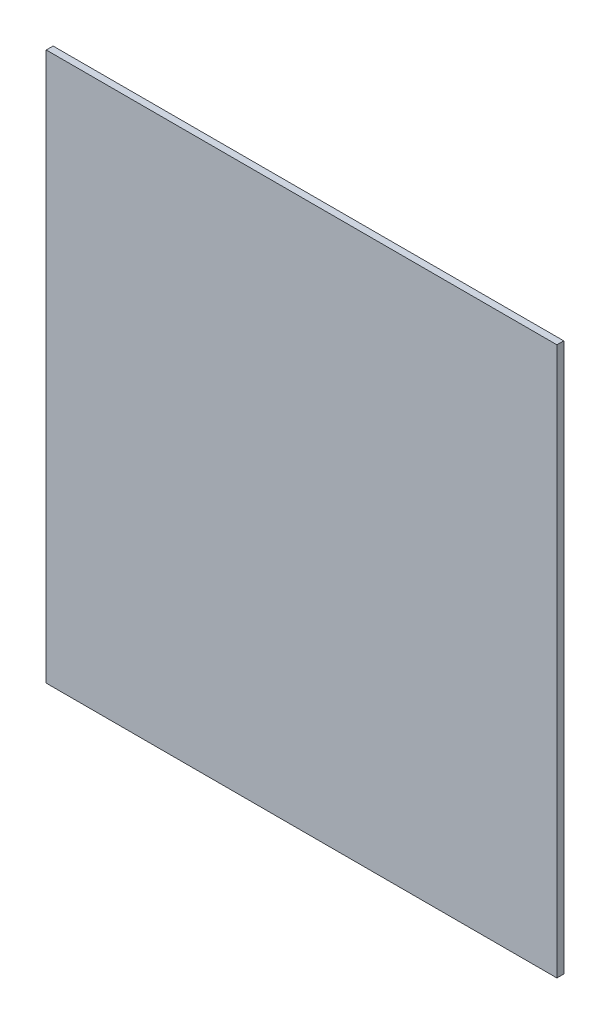
ISO-10303-21;
HEADER;
FILE_DESCRIPTION(('STEP AP214'),'2;1');
FILE_NAME('part.step','',(''),(''),'','','');
FILE_SCHEMA(('AUTOMOTIVE_DESIGN { 1 0 10303 214 1 1 1 1 }'));
ENDSEC;
DATA;
#1=APPLICATION_CONTEXT('core data for automotive mechanical design processes');
#2=APPLICATION_PROTOCOL_DEFINITION('international standard','automotive_design',2000,#1);
#3=PRODUCT_CONTEXT('',#1,'mechanical');
#4=PRODUCT('Part','Part','',(#3));
#5=PRODUCT_RELATED_PRODUCT_CATEGORY('part','',(#4));
#6=PRODUCT_DEFINITION_FORMATION('','',#4);
#7=PRODUCT_DEFINITION_CONTEXT('part definition',#1,'design');
#8=PRODUCT_DEFINITION('design','',#6,#7);
#9=PRODUCT_DEFINITION_SHAPE('','',#8);
#10=(LENGTH_UNIT() NAMED_UNIT(*) SI_UNIT(.MILLI.,.METRE.));
#11=(NAMED_UNIT(*) PLANE_ANGLE_UNIT() SI_UNIT($,.RADIAN.));
#12=(NAMED_UNIT(*) SI_UNIT($,.STERADIAN.) SOLID_ANGLE_UNIT());
#13=UNCERTAINTY_MEASURE_WITH_UNIT(LENGTH_MEASURE(1.E-05),#10,'distance_accuracy_value','');
#14=(GEOMETRIC_REPRESENTATION_CONTEXT(3) GLOBAL_UNCERTAINTY_ASSIGNED_CONTEXT((#13)) GLOBAL_UNIT_ASSIGNED_CONTEXT((#10,
#11,#12)) REPRESENTATION_CONTEXT('',''));
#15=CARTESIAN_POINT('',(0.,0.,0.));
#16=DIRECTION('',(0.,0.,1.));
#17=DIRECTION('',(1.,0.,0.));
#18=AXIS2_PLACEMENT_3D('',#15,#16,#17);
#19=CARTESIAN_POINT('',(74.5,-80.,2.));
#20=DIRECTION('',(-1.,0.,0.));
#21=DIRECTION('',(0.,0.,1.));
#22=AXIS2_PLACEMENT_3D('',#19,#20,#21);
#23=PLANE('',#22);
#24=DIRECTION('',(0.,1.,0.));
#25=VECTOR('',#24,1.);
#26=CARTESIAN_POINT('',(74.5,-80.,0.));
#27=LINE('',#26,#25);
#28=CARTESIAN_POINT('',(74.5,-80.,0.));
#29=VERTEX_POINT('',#28);
#30=CARTESIAN_POINT('',(74.5,80.,0.));
#31=VERTEX_POINT('',#30);
#32=EDGE_CURVE('E132',#29,#31,#27,.T.);
#33=ORIENTED_EDGE('',*,*,#32,.T.);
#34=DIRECTION('',(0.,0.,-1.));
#35=VECTOR('',#34,1.);
#36=CARTESIAN_POINT('',(74.5,80.,2.));
#37=LINE('',#36,#35);
#38=CARTESIAN_POINT('',(74.5,80.,2.));
#39=VERTEX_POINT('',#38);
#40=EDGE_CURVE('E43',#39,#31,#37,.T.);
#41=ORIENTED_EDGE('',*,*,#40,.F.);
#42=DIRECTION('',(0.,1.,0.));
#43=VECTOR('',#42,1.);
#44=CARTESIAN_POINT('',(74.5,-80.,2.));
#45=LINE('',#44,#43);
#46=CARTESIAN_POINT('',(74.5,-80.,2.));
#47=VERTEX_POINT('',#46);
#48=EDGE_CURVE('E120',#47,#39,#45,.T.);
#49=ORIENTED_EDGE('',*,*,#48,.F.);
#50=DIRECTION('',(0.,0.,-1.));
#51=VECTOR('',#50,1.);
#52=CARTESIAN_POINT('',(74.5,-80.,2.));
#53=LINE('',#52,#51);
#54=EDGE_CURVE('E128',#47,#29,#53,.T.);
#55=ORIENTED_EDGE('',*,*,#54,.T.);
#56=EDGE_LOOP('',(#33,#41,#49,#55));
#57=FACE_BOUND('',#56,.T.);
#58=ADVANCED_FACE('F69',(#57),#23,.F.);
#59=CARTESIAN_POINT('',(-74.5,80.,2.));
#60=DIRECTION('',(0.,-1.,0.));
#61=DIRECTION('',(0.,0.,-1.));
#62=AXIS2_PLACEMENT_3D('',#59,#60,#61);
#63=PLANE('',#62);
#64=DIRECTION('',(-1.,0.,0.));
#65=VECTOR('',#64,1.);
#66=CARTESIAN_POINT('',(-74.5,80.,0.));
#67=LINE('',#66,#65);
#68=CARTESIAN_POINT('',(-74.5,80.,0.));
#69=VERTEX_POINT('',#68);
#70=EDGE_CURVE('E124',#31,#69,#67,.T.);
#71=ORIENTED_EDGE('',*,*,#70,.T.);
#72=DIRECTION('',(0.,0.,-1.));
#73=VECTOR('',#72,1.);
#74=CARTESIAN_POINT('',(-74.5,80.,2.));
#75=LINE('',#74,#73);
#76=CARTESIAN_POINT('',(-74.5,80.,2.));
#77=VERTEX_POINT('',#76);
#78=EDGE_CURVE('E77',#77,#69,#75,.T.);
#79=ORIENTED_EDGE('',*,*,#78,.F.);
#80=DIRECTION('',(-1.,0.,0.));
#81=VECTOR('',#80,1.);
#82=CARTESIAN_POINT('',(-74.5,80.,2.));
#83=LINE('',#82,#81);
#84=EDGE_CURVE('E115',#39,#77,#83,.T.);
#85=ORIENTED_EDGE('',*,*,#84,.F.);
#86=ORIENTED_EDGE('',*,*,#40,.T.);
#87=EDGE_LOOP('',(#71,#79,#85,#86));
#88=FACE_BOUND('',#87,.T.);
#89=ADVANCED_FACE('F123',(#88),#63,.F.);
#90=CARTESIAN_POINT('',(-74.5,-80.,2.));
#91=DIRECTION('',(1.,0.,0.));
#92=DIRECTION('',(0.,0.,-1.));
#93=AXIS2_PLACEMENT_3D('',#90,#91,#92);
#94=PLANE('',#93);
#95=DIRECTION('',(0.,-1.,0.));
#96=VECTOR('',#95,1.);
#97=CARTESIAN_POINT('',(-74.5,-80.,0.));
#98=LINE('',#97,#96);
#99=CARTESIAN_POINT('',(-74.5,-80.,0.));
#100=VERTEX_POINT('',#99);
#101=EDGE_CURVE('E102',#69,#100,#98,.T.);
#102=ORIENTED_EDGE('',*,*,#101,.T.);
#103=DIRECTION('',(0.,0.,-1.));
#104=VECTOR('',#103,1.);
#105=CARTESIAN_POINT('',(-74.5,-80.,2.));
#106=LINE('',#105,#104);
#107=CARTESIAN_POINT('',(-74.5,-80.,2.));
#108=VERTEX_POINT('',#107);
#109=EDGE_CURVE('E125',#108,#100,#106,.T.);
#110=ORIENTED_EDGE('',*,*,#109,.F.);
#111=DIRECTION('',(0.,-1.,0.));
#112=VECTOR('',#111,1.);
#113=CARTESIAN_POINT('',(-74.5,-80.,2.));
#114=LINE('',#113,#112);
#115=EDGE_CURVE('E118',#77,#108,#114,.T.);
#116=ORIENTED_EDGE('',*,*,#115,.F.);
#117=ORIENTED_EDGE('',*,*,#78,.T.);
#118=EDGE_LOOP('',(#102,#110,#116,#117));
#119=FACE_BOUND('',#118,.T.);
#120=ADVANCED_FACE('F126',(#119),#94,.F.);
#121=CARTESIAN_POINT('',(-74.5,-80.,2.));
#122=DIRECTION('',(0.,1.,0.));
#123=DIRECTION('',(0.,0.,1.));
#124=AXIS2_PLACEMENT_3D('',#121,#122,#123);
#125=PLANE('',#124);
#126=DIRECTION('',(1.,0.,0.));
#127=VECTOR('',#126,1.);
#128=CARTESIAN_POINT('',(-74.5,-80.,0.));
#129=LINE('',#128,#127);
#130=EDGE_CURVE('E108',#100,#29,#129,.T.);
#131=ORIENTED_EDGE('',*,*,#130,.T.);
#132=ORIENTED_EDGE('',*,*,#54,.F.);
#133=DIRECTION('',(1.,0.,0.));
#134=VECTOR('',#133,1.);
#135=CARTESIAN_POINT('',(-74.5,-80.,2.));
#136=LINE('',#135,#134);
#137=EDGE_CURVE('E85',#108,#47,#136,.T.);
#138=ORIENTED_EDGE('',*,*,#137,.F.);
#139=ORIENTED_EDGE('',*,*,#109,.T.);
#140=EDGE_LOOP('',(#131,#132,#138,#139));
#141=FACE_BOUND('',#140,.T.);
#142=ADVANCED_FACE('F139',(#141),#125,.F.);
#143=CARTESIAN_POINT('',(0.,0.,2.));
#144=DIRECTION('',(0.,0.,-1.));
#145=DIRECTION('',(-1.,0.,0.));
#146=AXIS2_PLACEMENT_3D('',#143,#144,#145);
#147=PLANE('',#146);
#148=ORIENTED_EDGE('',*,*,#48,.T.);
#149=ORIENTED_EDGE('',*,*,#84,.T.);
#150=ORIENTED_EDGE('',*,*,#115,.T.);
#151=ORIENTED_EDGE('',*,*,#137,.T.);
#152=EDGE_LOOP('',(#148,#149,#150,#151));
#153=FACE_BOUND('',#152,.T.);
#154=ADVANCED_FACE('F116',(#153),#147,.F.);
#155=CARTESIAN_POINT('',(0.,0.,0.));
#156=DIRECTION('',(0.,0.,-1.));
#157=DIRECTION('',(-1.,0.,0.));
#158=AXIS2_PLACEMENT_3D('',#155,#156,#157);
#159=PLANE('',#158);
#160=ORIENTED_EDGE('',*,*,#32,.F.);
#161=ORIENTED_EDGE('',*,*,#130,.F.);
#162=ORIENTED_EDGE('',*,*,#101,.F.);
#163=ORIENTED_EDGE('',*,*,#70,.F.);
#164=EDGE_LOOP('',(#160,#161,#162,#163));
#165=FACE_BOUND('',#164,.T.);
#166=ADVANCED_FACE('F142',(#165),#159,.T.);
#167=CLOSED_SHELL('',(#58,#89,#120,#142,#154,#166));
#168=MANIFOLD_SOLID_BREP('B6',#167);
#169=ADVANCED_BREP_SHAPE_REPRESENTATION('',(#18,#168),#14);
#170=SHAPE_DEFINITION_REPRESENTATION(#9,#169);
ENDSEC;
END-ISO-10303-21;
